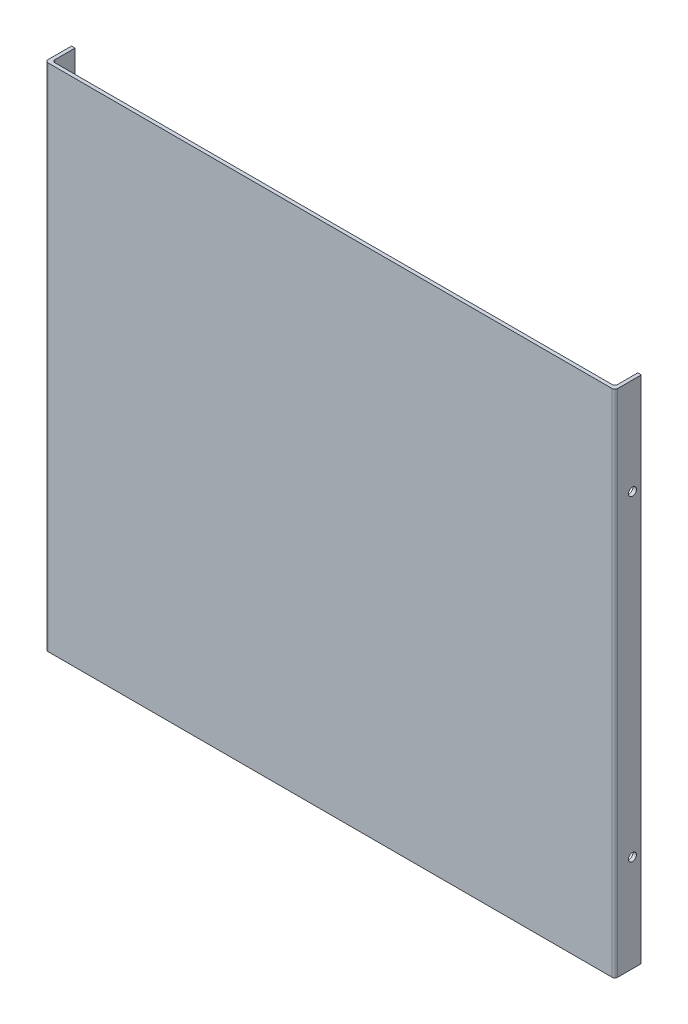
ISO-10303-21;
HEADER;
FILE_DESCRIPTION(('STEP AP214'),'2;1');
FILE_NAME('part.step','',(''),(''),'','','');
FILE_SCHEMA(('AUTOMOTIVE_DESIGN { 1 0 10303 214 1 1 1 1 }'));
ENDSEC;
DATA;
#1=APPLICATION_CONTEXT('core data for automotive mechanical design processes');
#2=APPLICATION_PROTOCOL_DEFINITION('international standard','automotive_design',2000,#1);
#3=PRODUCT_CONTEXT('',#1,'mechanical');
#4=PRODUCT('Part','Part','',(#3));
#5=PRODUCT_RELATED_PRODUCT_CATEGORY('part','',(#4));
#6=PRODUCT_DEFINITION_FORMATION('','',#4);
#7=PRODUCT_DEFINITION_CONTEXT('part definition',#1,'design');
#8=PRODUCT_DEFINITION('design','',#6,#7);
#9=PRODUCT_DEFINITION_SHAPE('','',#8);
#10=(LENGTH_UNIT() NAMED_UNIT(*) SI_UNIT(.MILLI.,.METRE.));
#11=(NAMED_UNIT(*) PLANE_ANGLE_UNIT() SI_UNIT($,.RADIAN.));
#12=(NAMED_UNIT(*) SI_UNIT($,.STERADIAN.) SOLID_ANGLE_UNIT());
#13=UNCERTAINTY_MEASURE_WITH_UNIT(LENGTH_MEASURE(1.E-05),#10,'distance_accuracy_value','');
#14=(GEOMETRIC_REPRESENTATION_CONTEXT(3) GLOBAL_UNCERTAINTY_ASSIGNED_CONTEXT((#13)) GLOBAL_UNIT_ASSIGNED_CONTEXT((#10,
#11,#12)) REPRESENTATION_CONTEXT('',''));
#15=CARTESIAN_POINT('',(0.,0.,0.));
#16=DIRECTION('',(0.,0.,1.));
#17=DIRECTION('',(1.,0.,0.));
#18=AXIS2_PLACEMENT_3D('',#15,#16,#17);
#19=CARTESIAN_POINT('',(-160.,145.,2.));
#20=DIRECTION('',(0.,-1.,0.));
#21=DIRECTION('',(0.,0.,-1.));
#22=AXIS2_PLACEMENT_3D('',#19,#20,#21);
#23=PLANE('',#22);
#24=DIRECTION('',(-1.,0.,0.));
#25=VECTOR('',#24,1.);
#26=CARTESIAN_POINT('',(-160.,145.,2.));
#27=LINE('',#26,#25);
#28=CARTESIAN_POINT('',(160.5,145.,2.));
#29=VERTEX_POINT('',#28);
#30=CARTESIAN_POINT('',(-160.5,145.,2.));
#31=VERTEX_POINT('',#30);
#32=EDGE_CURVE('E183',#29,#31,#27,.T.);
#33=ORIENTED_EDGE('',*,*,#32,.F.);
#34=CARTESIAN_POINT('',(160.5,145.,0.5));
#35=DIRECTION('',(0.,-1.,0.));
#36=DIRECTION('',(0.,0.,-1.));
#37=AXIS2_PLACEMENT_3D('',#34,#35,#36);
#38=CIRCLE('',#37,1.5);
#39=CARTESIAN_POINT('',(162.,145.,0.5));
#40=VERTEX_POINT('',#39);
#41=EDGE_CURVE('E58',#29,#40,#38,.F.);
#42=ORIENTED_EDGE('',*,*,#41,.T.);
#43=DIRECTION('',(0.,0.,-1.));
#44=VECTOR('',#43,1.);
#45=CARTESIAN_POINT('',(162.,145.,2.));
#46=LINE('',#45,#44);
#47=CARTESIAN_POINT('',(162.,145.,-13.));
#48=VERTEX_POINT('',#47);
#49=EDGE_CURVE('E144',#40,#48,#46,.T.);
#50=ORIENTED_EDGE('',*,*,#49,.T.);
#51=DIRECTION('',(-1.,0.,0.));
#52=VECTOR('',#51,1.);
#53=CARTESIAN_POINT('',(162.,145.,-13.));
#54=LINE('',#53,#52);
#55=CARTESIAN_POINT('',(160.,145.,-13.));
#56=VERTEX_POINT('',#55);
#57=EDGE_CURVE('E134',#48,#56,#54,.T.);
#58=ORIENTED_EDGE('',*,*,#57,.T.);
#59=DIRECTION('',(0.,0.,-1.));
#60=VECTOR('',#59,1.);
#61=CARTESIAN_POINT('',(160.,145.,2.));
#62=LINE('',#61,#60);
#63=CARTESIAN_POINT('',(160.,145.,-1.5));
#64=VERTEX_POINT('',#63);
#65=EDGE_CURVE('E139',#64,#56,#62,.T.);
#66=ORIENTED_EDGE('',*,*,#65,.F.);
#67=CARTESIAN_POINT('',(158.5,145.,-1.5));
#68=DIRECTION('',(0.,-1.,0.));
#69=DIRECTION('',(0.,0.,-1.));
#70=AXIS2_PLACEMENT_3D('',#67,#68,#69);
#71=CIRCLE('',#70,1.5);
#72=CARTESIAN_POINT('',(158.5,145.,0.));
#73=VERTEX_POINT('',#72);
#74=EDGE_CURVE('E42',#64,#73,#71,.T.);
#75=ORIENTED_EDGE('',*,*,#74,.T.);
#76=DIRECTION('',(-1.,0.,0.));
#77=VECTOR('',#76,1.);
#78=CARTESIAN_POINT('',(-160.,145.,0.));
#79=LINE('',#78,#77);
#80=CARTESIAN_POINT('',(-158.5,145.,0.));
#81=VERTEX_POINT('',#80);
#82=EDGE_CURVE('E184',#73,#81,#79,.T.);
#83=ORIENTED_EDGE('',*,*,#82,.T.);
#84=CARTESIAN_POINT('',(-158.5,145.,-1.5));
#85=DIRECTION('',(0.,-1.,0.));
#86=DIRECTION('',(0.,0.,-1.));
#87=AXIS2_PLACEMENT_3D('',#84,#85,#86);
#88=CIRCLE('',#87,1.5);
#89=CARTESIAN_POINT('',(-160.,145.,-1.5));
#90=VERTEX_POINT('',#89);
#91=EDGE_CURVE('E273',#81,#90,#88,.T.);
#92=ORIENTED_EDGE('',*,*,#91,.T.);
#93=DIRECTION('',(0.,0.,-1.));
#94=VECTOR('',#93,1.);
#95=CARTESIAN_POINT('',(-160.,145.,2.));
#96=LINE('',#95,#94);
#97=CARTESIAN_POINT('',(-160.,145.,-13.));
#98=VERTEX_POINT('',#97);
#99=EDGE_CURVE('E133',#90,#98,#96,.T.);
#100=ORIENTED_EDGE('',*,*,#99,.T.);
#101=DIRECTION('',(1.,0.,0.));
#102=VECTOR('',#101,1.);
#103=CARTESIAN_POINT('',(-162.,145.,-13.));
#104=LINE('',#103,#102);
#105=CARTESIAN_POINT('',(-162.,145.,-13.));
#106=VERTEX_POINT('',#105);
#107=EDGE_CURVE('E193',#106,#98,#104,.T.);
#108=ORIENTED_EDGE('',*,*,#107,.F.);
#109=DIRECTION('',(0.,0.,-1.));
#110=VECTOR('',#109,1.);
#111=CARTESIAN_POINT('',(-162.,145.,2.));
#112=LINE('',#111,#110);
#113=CARTESIAN_POINT('',(-162.,145.,0.5));
#114=VERTEX_POINT('',#113);
#115=EDGE_CURVE('E157',#114,#106,#112,.T.);
#116=ORIENTED_EDGE('',*,*,#115,.F.);
#117=CARTESIAN_POINT('',(-160.5,145.,0.5));
#118=DIRECTION('',(0.,-1.,0.));
#119=DIRECTION('',(0.,0.,-1.));
#120=AXIS2_PLACEMENT_3D('',#117,#118,#119);
#121=CIRCLE('',#120,1.5);
#122=EDGE_CURVE('E265',#114,#31,#121,.F.);
#123=ORIENTED_EDGE('',*,*,#122,.T.);
#124=EDGE_LOOP('',(#33,#42,#50,#58,#66,#75,#83,#92,#100,#108,#116,#123));
#125=FACE_BOUND('',#124,.T.);
#126=ADVANCED_FACE('F33',(#125),#23,.F.);
#127=CARTESIAN_POINT('',(-160.,-145.,2.));
#128=DIRECTION('',(0.,1.,0.));
#129=DIRECTION('',(0.,0.,1.));
#130=AXIS2_PLACEMENT_3D('',#127,#128,#129);
#131=PLANE('',#130);
#132=DIRECTION('',(0.,0.,1.));
#133=VECTOR('',#132,1.);
#134=CARTESIAN_POINT('',(162.,-145.,2.00000000000004));
#135=LINE('',#134,#133);
#136=CARTESIAN_POINT('',(162.,-145.,-13.));
#137=VERTEX_POINT('',#136);
#138=CARTESIAN_POINT('',(162.,-145.,0.5));
#139=VERTEX_POINT('',#138);
#140=EDGE_CURVE('E125',#137,#139,#135,.T.);
#141=ORIENTED_EDGE('',*,*,#140,.T.);
#142=CARTESIAN_POINT('',(160.5,-145.,0.5));
#143=DIRECTION('',(0.,1.,0.));
#144=DIRECTION('',(0.,0.,1.));
#145=AXIS2_PLACEMENT_3D('',#142,#143,#144);
#146=CIRCLE('',#145,1.5);
#147=CARTESIAN_POINT('',(160.5,-145.,2.));
#148=VERTEX_POINT('',#147);
#149=EDGE_CURVE('E219',#139,#148,#146,.F.);
#150=ORIENTED_EDGE('',*,*,#149,.T.);
#151=DIRECTION('',(1.,0.,0.));
#152=VECTOR('',#151,1.);
#153=CARTESIAN_POINT('',(-160.,-145.,2.));
#154=LINE('',#153,#152);
#155=CARTESIAN_POINT('',(-160.5,-145.,2.));
#156=VERTEX_POINT('',#155);
#157=EDGE_CURVE('E179',#156,#148,#154,.T.);
#158=ORIENTED_EDGE('',*,*,#157,.F.);
#159=CARTESIAN_POINT('',(-160.5,-145.,0.5));
#160=DIRECTION('',(0.,1.,0.));
#161=DIRECTION('',(0.,0.,1.));
#162=AXIS2_PLACEMENT_3D('',#159,#160,#161);
#163=CIRCLE('',#162,1.5);
#164=CARTESIAN_POINT('',(-162.,-145.,0.5));
#165=VERTEX_POINT('',#164);
#166=EDGE_CURVE('E263',#156,#165,#163,.F.);
#167=ORIENTED_EDGE('',*,*,#166,.T.);
#168=DIRECTION('',(0.,0.,1.));
#169=VECTOR('',#168,1.);
#170=CARTESIAN_POINT('',(-162.,-145.,2.00000000000004));
#171=LINE('',#170,#169);
#172=CARTESIAN_POINT('',(-162.,-145.,-13.));
#173=VERTEX_POINT('',#172);
#174=EDGE_CURVE('E162',#173,#165,#171,.T.);
#175=ORIENTED_EDGE('',*,*,#174,.F.);
#176=DIRECTION('',(1.,0.,0.));
#177=VECTOR('',#176,1.);
#178=CARTESIAN_POINT('',(-162.,-145.,-13.));
#179=LINE('',#178,#177);
#180=CARTESIAN_POINT('',(-160.,-145.,-13.));
#181=VERTEX_POINT('',#180);
#182=EDGE_CURVE('E165',#173,#181,#179,.T.);
#183=ORIENTED_EDGE('',*,*,#182,.T.);
#184=DIRECTION('',(0.,0.,1.));
#185=VECTOR('',#184,1.);
#186=CARTESIAN_POINT('',(-160.,-145.,2.00000000000004));
#187=LINE('',#186,#185);
#188=CARTESIAN_POINT('',(-160.,-145.,-1.5));
#189=VERTEX_POINT('',#188);
#190=EDGE_CURVE('E160',#181,#189,#187,.T.);
#191=ORIENTED_EDGE('',*,*,#190,.T.);
#192=CARTESIAN_POINT('',(-158.5,-145.,-1.5));
#193=DIRECTION('',(0.,1.,0.));
#194=DIRECTION('',(0.,0.,1.));
#195=AXIS2_PLACEMENT_3D('',#192,#193,#194);
#196=CIRCLE('',#195,1.5);
#197=CARTESIAN_POINT('',(-158.5,-145.,0.));
#198=VERTEX_POINT('',#197);
#199=EDGE_CURVE('E271',#189,#198,#196,.T.);
#200=ORIENTED_EDGE('',*,*,#199,.T.);
#201=DIRECTION('',(1.,0.,0.));
#202=VECTOR('',#201,1.);
#203=CARTESIAN_POINT('',(-160.,-145.,0.));
#204=LINE('',#203,#202);
#205=CARTESIAN_POINT('',(158.5,-145.,0.));
#206=VERTEX_POINT('',#205);
#207=EDGE_CURVE('E180',#198,#206,#204,.T.);
#208=ORIENTED_EDGE('',*,*,#207,.T.);
#209=CARTESIAN_POINT('',(158.5,-145.,-1.5));
#210=DIRECTION('',(0.,1.,0.));
#211=DIRECTION('',(0.,0.,1.));
#212=AXIS2_PLACEMENT_3D('',#209,#210,#211);
#213=CIRCLE('',#212,1.5);
#214=CARTESIAN_POINT('',(160.,-145.,-1.5));
#215=VERTEX_POINT('',#214);
#216=EDGE_CURVE('E11',#206,#215,#213,.T.);
#217=ORIENTED_EDGE('',*,*,#216,.T.);
#218=DIRECTION('',(0.,0.,1.));
#219=VECTOR('',#218,1.);
#220=CARTESIAN_POINT('',(160.,-145.,2.00000000000004));
#221=LINE('',#220,#219);
#222=CARTESIAN_POINT('',(160.,-145.,-13.));
#223=VERTEX_POINT('',#222);
#224=EDGE_CURVE('E128',#223,#215,#221,.T.);
#225=ORIENTED_EDGE('',*,*,#224,.F.);
#226=DIRECTION('',(-1.,0.,0.));
#227=VECTOR('',#226,1.);
#228=CARTESIAN_POINT('',(162.,-145.,-13.));
#229=LINE('',#228,#227);
#230=EDGE_CURVE('E123',#137,#223,#229,.T.);
#231=ORIENTED_EDGE('',*,*,#230,.F.);
#232=EDGE_LOOP('',(#141,#150,#158,#167,#175,#183,#191,#200,#208,#217,#225,#231));
#233=FACE_BOUND('',#232,.T.);
#234=ADVANCED_FACE('F124',(#233),#131,.F.);
#235=CARTESIAN_POINT('',(0.,0.,2.));
#236=DIRECTION('',(0.,0.,-1.));
#237=DIRECTION('',(-1.,0.,0.));
#238=AXIS2_PLACEMENT_3D('',#235,#236,#237);
#239=PLANE('',#238);
#240=ORIENTED_EDGE('',*,*,#157,.T.);
#241=DIRECTION('',(0.,1.,0.));
#242=VECTOR('',#241,1.);
#243=CARTESIAN_POINT('',(160.5,0.,2.));
#244=LINE('',#243,#242);
#245=EDGE_CURVE('E214',#148,#29,#244,.T.);
#246=ORIENTED_EDGE('',*,*,#245,.T.);
#247=ORIENTED_EDGE('',*,*,#32,.T.);
#248=DIRECTION('',(0.,1.,0.));
#249=VECTOR('',#248,1.);
#250=CARTESIAN_POINT('',(-160.5,0.,2.));
#251=LINE('',#250,#249);
#252=EDGE_CURVE('E266',#31,#156,#251,.F.);
#253=ORIENTED_EDGE('',*,*,#252,.T.);
#254=EDGE_LOOP('',(#240,#246,#247,#253));
#255=FACE_BOUND('',#254,.T.);
#256=ADVANCED_FACE('F299',(#255),#239,.F.);
#257=CARTESIAN_POINT('',(0.,0.,0.));
#258=DIRECTION('',(0.,0.,-1.));
#259=DIRECTION('',(-1.,0.,0.));
#260=AXIS2_PLACEMENT_3D('',#257,#258,#259);
#261=PLANE('',#260);
#262=ORIENTED_EDGE('',*,*,#82,.F.);
#263=DIRECTION('',(0.,1.,0.));
#264=VECTOR('',#263,1.);
#265=CARTESIAN_POINT('',(158.5,-145.,0.));
#266=LINE('',#265,#264);
#267=EDGE_CURVE('E212',#73,#206,#266,.F.);
#268=ORIENTED_EDGE('',*,*,#267,.T.);
#269=ORIENTED_EDGE('',*,*,#207,.F.);
#270=DIRECTION('',(0.,-1.,0.));
#271=VECTOR('',#270,1.);
#272=CARTESIAN_POINT('',(-158.5,145.,0.));
#273=LINE('',#272,#271);
#274=EDGE_CURVE('E178',#198,#81,#273,.F.);
#275=ORIENTED_EDGE('',*,*,#274,.T.);
#276=EDGE_LOOP('',(#262,#268,#269,#275));
#277=FACE_BOUND('',#276,.T.);
#278=ADVANCED_FACE('F285',(#277),#261,.T.);
#279=CARTESIAN_POINT('',(-162.,145.,-13.));
#280=DIRECTION('',(0.,0.,1.));
#281=DIRECTION('',(0.,-1.,0.));
#282=AXIS2_PLACEMENT_3D('',#279,#280,#281);
#283=PLANE('',#282);
#284=DIRECTION('',(0.,-1.,0.));
#285=VECTOR('',#284,1.);
#286=CARTESIAN_POINT('',(-160.,145.,-13.));
#287=LINE('',#286,#285);
#288=EDGE_CURVE('E168',#98,#181,#287,.T.);
#289=ORIENTED_EDGE('',*,*,#288,.T.);
#290=ORIENTED_EDGE('',*,*,#182,.F.);
#291=DIRECTION('',(0.,-1.,0.));
#292=VECTOR('',#291,1.);
#293=CARTESIAN_POINT('',(-162.,145.,-13.));
#294=LINE('',#293,#292);
#295=EDGE_CURVE('E159',#106,#173,#294,.T.);
#296=ORIENTED_EDGE('',*,*,#295,.F.);
#297=ORIENTED_EDGE('',*,*,#107,.T.);
#298=EDGE_LOOP('',(#289,#290,#296,#297));
#299=FACE_BOUND('',#298,.T.);
#300=ADVANCED_FACE('F251',(#299),#283,.F.);
#301=CARTESIAN_POINT('',(-162.,0.,0.));
#302=DIRECTION('',(1.,0.,0.));
#303=DIRECTION('',(0.,0.,-1.));
#304=AXIS2_PLACEMENT_3D('',#301,#302,#303);
#305=PLANE('',#304);
#306=CARTESIAN_POINT('',(-162.,-90.,-8.00000000000004));
#307=DIRECTION('',(-1.,0.,0.));
#308=DIRECTION('',(0.,0.,1.));
#309=AXIS2_PLACEMENT_3D('',#306,#307,#308);
#310=CIRCLE('',#309,2.25);
#311=CARTESIAN_POINT('',(-162.,-90.,-5.75000000000004));
#312=VERTEX_POINT('',#311);
#313=EDGE_CURVE('E241',#312,#312,#310,.T.);
#314=ORIENTED_EDGE('',*,*,#313,.F.);
#315=EDGE_LOOP('',(#314));
#316=FACE_BOUND('',#315,.T.);
#317=CARTESIAN_POINT('',(-162.,90.,-8.00000000000006));
#318=DIRECTION('',(-1.,0.,0.));
#319=DIRECTION('',(0.,0.,1.));
#320=AXIS2_PLACEMENT_3D('',#317,#318,#319);
#321=CIRCLE('',#320,2.25);
#322=CARTESIAN_POINT('',(-162.,90.,-5.75000000000006));
#323=VERTEX_POINT('',#322);
#324=EDGE_CURVE('E228',#323,#323,#321,.T.);
#325=ORIENTED_EDGE('',*,*,#324,.F.);
#326=EDGE_LOOP('',(#325));
#327=FACE_BOUND('',#326,.T.);
#328=ORIENTED_EDGE('',*,*,#174,.T.);
#329=DIRECTION('',(0.,1.,0.));
#330=VECTOR('',#329,1.);
#331=CARTESIAN_POINT('',(-162.,0.,0.5));
#332=LINE('',#331,#330);
#333=EDGE_CURVE('E257',#165,#114,#332,.T.);
#334=ORIENTED_EDGE('',*,*,#333,.T.);
#335=ORIENTED_EDGE('',*,*,#115,.T.);
#336=ORIENTED_EDGE('',*,*,#295,.T.);
#337=EDGE_LOOP('',(#328,#334,#335,#336));
#338=FACE_BOUND('',#337,.T.);
#339=ADVANCED_FACE('F247',(#316,#327,#338),#305,.F.);
#340=CARTESIAN_POINT('',(-160.,0.,0.));
#341=DIRECTION('',(1.,0.,0.));
#342=DIRECTION('',(0.,0.,-1.));
#343=AXIS2_PLACEMENT_3D('',#340,#341,#342);
#344=PLANE('',#343);
#345=CARTESIAN_POINT('',(-160.,-90.,-8.00000000000004));
#346=DIRECTION('',(1.,0.,0.));
#347=DIRECTION('',(0.,0.,-1.));
#348=AXIS2_PLACEMENT_3D('',#345,#346,#347);
#349=CIRCLE('',#348,2.24999999999998);
#350=CARTESIAN_POINT('',(-160.,-90.,-10.25));
#351=VERTEX_POINT('',#350);
#352=EDGE_CURVE('E233',#351,#351,#349,.T.);
#353=ORIENTED_EDGE('',*,*,#352,.F.);
#354=EDGE_LOOP('',(#353));
#355=FACE_BOUND('',#354,.T.);
#356=CARTESIAN_POINT('',(-160.,90.,-8.00000000000006));
#357=DIRECTION('',(1.,0.,0.));
#358=DIRECTION('',(0.,0.,-1.));
#359=AXIS2_PLACEMENT_3D('',#356,#357,#358);
#360=CIRCLE('',#359,2.24999999999998);
#361=CARTESIAN_POINT('',(-160.,90.,-10.25));
#362=VERTEX_POINT('',#361);
#363=EDGE_CURVE('E155',#362,#362,#360,.T.);
#364=ORIENTED_EDGE('',*,*,#363,.F.);
#365=EDGE_LOOP('',(#364));
#366=FACE_BOUND('',#365,.T.);
#367=ORIENTED_EDGE('',*,*,#99,.F.);
#368=DIRECTION('',(0.,-1.,0.));
#369=VECTOR('',#368,1.);
#370=CARTESIAN_POINT('',(-160.,-145.,-1.5));
#371=LINE('',#370,#369);
#372=EDGE_CURVE('E175',#90,#189,#371,.T.);
#373=ORIENTED_EDGE('',*,*,#372,.T.);
#374=ORIENTED_EDGE('',*,*,#190,.F.);
#375=ORIENTED_EDGE('',*,*,#288,.F.);
#376=EDGE_LOOP('',(#367,#373,#374,#375));
#377=FACE_BOUND('',#376,.T.);
#378=ADVANCED_FACE('F250',(#355,#366,#377),#344,.T.);
#379=CARTESIAN_POINT('',(-158.5,0.,-1.5));
#380=DIRECTION('',(0.,1.,0.));
#381=DIRECTION('',(0.,0.,1.));
#382=AXIS2_PLACEMENT_3D('',#379,#380,#381);
#383=CYLINDRICAL_SURFACE('',#382,1.5);
#384=ORIENTED_EDGE('',*,*,#91,.F.);
#385=ORIENTED_EDGE('',*,*,#274,.F.);
#386=ORIENTED_EDGE('',*,*,#199,.F.);
#387=ORIENTED_EDGE('',*,*,#372,.F.);
#388=EDGE_LOOP('',(#384,#385,#386,#387));
#389=FACE_BOUND('',#388,.T.);
#390=ADVANCED_FACE('F291',(#389),#383,.F.);
#391=CARTESIAN_POINT('',(-160.5,0.,0.5));
#392=DIRECTION('',(0.,1.,0.));
#393=DIRECTION('',(0.,0.,1.));
#394=AXIS2_PLACEMENT_3D('',#391,#392,#393);
#395=CYLINDRICAL_SURFACE('',#394,1.5);
#396=ORIENTED_EDGE('',*,*,#166,.F.);
#397=ORIENTED_EDGE('',*,*,#252,.F.);
#398=ORIENTED_EDGE('',*,*,#122,.F.);
#399=ORIENTED_EDGE('',*,*,#333,.F.);
#400=EDGE_LOOP('',(#396,#397,#398,#399));
#401=FACE_BOUND('',#400,.T.);
#402=ADVANCED_FACE('F261',(#401),#395,.T.);
#403=CARTESIAN_POINT('',(162.,145.,-13.));
#404=DIRECTION('',(0.,0.,-1.));
#405=DIRECTION('',(0.,1.,0.));
#406=AXIS2_PLACEMENT_3D('',#403,#404,#405);
#407=PLANE('',#406);
#408=DIRECTION('',(0.,-1.,0.));
#409=VECTOR('',#408,1.);
#410=CARTESIAN_POINT('',(160.,145.,-13.));
#411=LINE('',#410,#409);
#412=EDGE_CURVE('E151',#56,#223,#411,.T.);
#413=ORIENTED_EDGE('',*,*,#412,.F.);
#414=ORIENTED_EDGE('',*,*,#57,.F.);
#415=DIRECTION('',(0.,-1.,0.));
#416=VECTOR('',#415,1.);
#417=CARTESIAN_POINT('',(162.,145.,-13.));
#418=LINE('',#417,#416);
#419=EDGE_CURVE('E138',#48,#137,#418,.T.);
#420=ORIENTED_EDGE('',*,*,#419,.T.);
#421=ORIENTED_EDGE('',*,*,#230,.T.);
#422=EDGE_LOOP('',(#413,#414,#420,#421));
#423=FACE_BOUND('',#422,.T.);
#424=ADVANCED_FACE('F142',(#423),#407,.T.);
#425=CARTESIAN_POINT('',(162.,0.,0.));
#426=DIRECTION('',(-1.,0.,0.));
#427=DIRECTION('',(0.,0.,-1.));
#428=AXIS2_PLACEMENT_3D('',#425,#426,#427);
#429=PLANE('',#428);
#430=CARTESIAN_POINT('',(162.,-90.,-8.00000000000004));
#431=DIRECTION('',(-1.,0.,0.));
#432=DIRECTION('',(0.,0.,1.));
#433=AXIS2_PLACEMENT_3D('',#430,#431,#432);
#434=CIRCLE('',#433,2.24999999999996);
#435=CARTESIAN_POINT('',(162.,-90.,-5.75000000000008));
#436=VERTEX_POINT('',#435);
#437=EDGE_CURVE('E238',#436,#436,#434,.T.);
#438=ORIENTED_EDGE('',*,*,#437,.T.);
#439=EDGE_LOOP('',(#438));
#440=FACE_BOUND('',#439,.T.);
#441=CARTESIAN_POINT('',(162.,90.,-8.00000000000006));
#442=DIRECTION('',(-1.,0.,0.));
#443=DIRECTION('',(0.,0.,1.));
#444=AXIS2_PLACEMENT_3D('',#441,#442,#443);
#445=CIRCLE('',#444,2.24999999999996);
#446=CARTESIAN_POINT('',(162.,90.,-5.7500000000001));
#447=VERTEX_POINT('',#446);
#448=EDGE_CURVE('E223',#447,#447,#445,.T.);
#449=ORIENTED_EDGE('',*,*,#448,.T.);
#450=EDGE_LOOP('',(#449));
#451=FACE_BOUND('',#450,.T.);
#452=ORIENTED_EDGE('',*,*,#49,.F.);
#453=DIRECTION('',(0.,1.,0.));
#454=VECTOR('',#453,1.);
#455=CARTESIAN_POINT('',(162.,0.,0.5));
#456=LINE('',#455,#454);
#457=EDGE_CURVE('E50',#40,#139,#456,.F.);
#458=ORIENTED_EDGE('',*,*,#457,.T.);
#459=ORIENTED_EDGE('',*,*,#140,.F.);
#460=ORIENTED_EDGE('',*,*,#419,.F.);
#461=EDGE_LOOP('',(#452,#458,#459,#460));
#462=FACE_BOUND('',#461,.T.);
#463=ADVANCED_FACE('F137',(#440,#451,#462),#429,.F.);
#464=CARTESIAN_POINT('',(160.,0.,0.));
#465=DIRECTION('',(-1.,0.,0.));
#466=DIRECTION('',(0.,0.,-1.));
#467=AXIS2_PLACEMENT_3D('',#464,#465,#466);
#468=PLANE('',#467);
#469=CARTESIAN_POINT('',(160.,-90.,-8.00000000000004));
#470=DIRECTION('',(-1.,0.,0.));
#471=DIRECTION('',(0.,0.,1.));
#472=AXIS2_PLACEMENT_3D('',#469,#470,#471);
#473=CIRCLE('',#472,2.24999999999998);
#474=CARTESIAN_POINT('',(160.,-90.,-5.75000000000006));
#475=VERTEX_POINT('',#474);
#476=EDGE_CURVE('E37',#475,#475,#473,.T.);
#477=ORIENTED_EDGE('',*,*,#476,.F.);
#478=EDGE_LOOP('',(#477));
#479=FACE_BOUND('',#478,.T.);
#480=CARTESIAN_POINT('',(160.,90.,-8.00000000000006));
#481=DIRECTION('',(-1.,0.,0.));
#482=DIRECTION('',(0.,0.,1.));
#483=AXIS2_PLACEMENT_3D('',#480,#481,#482);
#484=CIRCLE('',#483,2.24999999999998);
#485=CARTESIAN_POINT('',(160.,90.,-5.75000000000008));
#486=VERTEX_POINT('',#485);
#487=EDGE_CURVE('E221',#486,#486,#484,.T.);
#488=ORIENTED_EDGE('',*,*,#487,.F.);
#489=EDGE_LOOP('',(#488));
#490=FACE_BOUND('',#489,.T.);
#491=ORIENTED_EDGE('',*,*,#224,.T.);
#492=DIRECTION('',(0.,1.,0.));
#493=VECTOR('',#492,1.);
#494=CARTESIAN_POINT('',(160.,145.,-1.5));
#495=LINE('',#494,#493);
#496=EDGE_CURVE('E210',#215,#64,#495,.T.);
#497=ORIENTED_EDGE('',*,*,#496,.T.);
#498=ORIENTED_EDGE('',*,*,#65,.T.);
#499=ORIENTED_EDGE('',*,*,#412,.T.);
#500=EDGE_LOOP('',(#491,#497,#498,#499));
#501=FACE_BOUND('',#500,.T.);
#502=ADVANCED_FACE('F277',(#479,#490,#501),#468,.T.);
#503=CARTESIAN_POINT('',(158.5,0.,-1.5));
#504=DIRECTION('',(0.,-1.,0.));
#505=DIRECTION('',(0.,0.,-1.));
#506=AXIS2_PLACEMENT_3D('',#503,#504,#505);
#507=CYLINDRICAL_SURFACE('',#506,1.5);
#508=ORIENTED_EDGE('',*,*,#216,.F.);
#509=ORIENTED_EDGE('',*,*,#267,.F.);
#510=ORIENTED_EDGE('',*,*,#74,.F.);
#511=ORIENTED_EDGE('',*,*,#496,.F.);
#512=EDGE_LOOP('',(#508,#509,#510,#511));
#513=FACE_BOUND('',#512,.T.);
#514=ADVANCED_FACE('F282',(#513),#507,.F.);
#515=CARTESIAN_POINT('',(160.5,0.,0.5));
#516=DIRECTION('',(0.,1.,0.));
#517=DIRECTION('',(0.,0.,1.));
#518=AXIS2_PLACEMENT_3D('',#515,#516,#517);
#519=CYLINDRICAL_SURFACE('',#518,1.5);
#520=ORIENTED_EDGE('',*,*,#149,.F.);
#521=ORIENTED_EDGE('',*,*,#457,.F.);
#522=ORIENTED_EDGE('',*,*,#41,.F.);
#523=ORIENTED_EDGE('',*,*,#245,.F.);
#524=EDGE_LOOP('',(#520,#521,#522,#523));
#525=FACE_BOUND('',#524,.T.);
#526=ADVANCED_FACE('F35',(#525),#519,.T.);
#527=CARTESIAN_POINT('',(-162.,90.,-8.00000000000006));
#528=DIRECTION('',(-1.,0.,0.));
#529=DIRECTION('',(0.,0.,1.));
#530=AXIS2_PLACEMENT_3D('',#527,#528,#529);
#531=CYLINDRICAL_SURFACE('',#530,2.24999999999998);
#532=ORIENTED_EDGE('',*,*,#487,.T.);
#533=EDGE_LOOP('',(#532));
#534=FACE_BOUND('',#533,.T.);
#535=ORIENTED_EDGE('',*,*,#448,.F.);
#536=EDGE_LOOP('',(#535));
#537=FACE_BOUND('',#536,.T.);
#538=ADVANCED_FACE('F318',(#534,#537),#531,.F.);
#539=ORIENTED_EDGE('',*,*,#363,.T.);
#540=EDGE_LOOP('',(#539));
#541=FACE_BOUND('',#540,.T.);
#542=ORIENTED_EDGE('',*,*,#324,.T.);
#543=EDGE_LOOP('',(#542));
#544=FACE_BOUND('',#543,.T.);
#545=ADVANCED_FACE('F340',(#541,#544),#531,.F.);
#546=CARTESIAN_POINT('',(-162.,-90.,-8.00000000000004));
#547=DIRECTION('',(-1.,0.,0.));
#548=DIRECTION('',(0.,0.,1.));
#549=AXIS2_PLACEMENT_3D('',#546,#547,#548);
#550=CYLINDRICAL_SURFACE('',#549,2.24999999999998);
#551=ORIENTED_EDGE('',*,*,#476,.T.);
#552=EDGE_LOOP('',(#551));
#553=FACE_BOUND('',#552,.T.);
#554=ORIENTED_EDGE('',*,*,#437,.F.);
#555=EDGE_LOOP('',(#554));
#556=FACE_BOUND('',#555,.T.);
#557=ADVANCED_FACE('F343',(#553,#556),#550,.F.);
#558=ORIENTED_EDGE('',*,*,#352,.T.);
#559=EDGE_LOOP('',(#558));
#560=FACE_BOUND('',#559,.T.);
#561=ORIENTED_EDGE('',*,*,#313,.T.);
#562=EDGE_LOOP('',(#561));
#563=FACE_BOUND('',#562,.T.);
#564=ADVANCED_FACE('F245',(#560,#563),#550,.F.);
#565=CLOSED_SHELL('',(#126,#234,#256,#278,#300,#339,#378,#390,#402,#424,#463,#502,#514,#526,
#538,#545,#557,#564));
#566=MANIFOLD_SOLID_BREP('B2',#565);
#567=ADVANCED_BREP_SHAPE_REPRESENTATION('',(#18,#566),#14);
#568=SHAPE_DEFINITION_REPRESENTATION(#9,#567);
ENDSEC;
END-ISO-10303-21;
